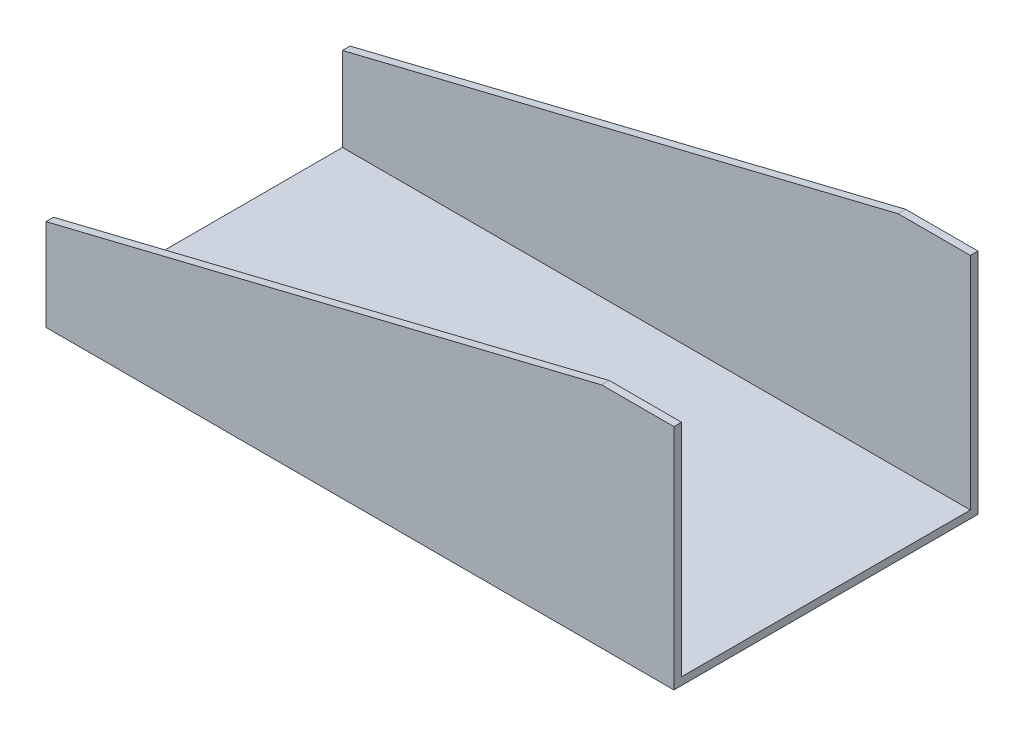
ISO-10303-21;
HEADER;
FILE_DESCRIPTION(('STEP AP214'),'2;1');
FILE_NAME('part.step','',(''),(''),'','','');
FILE_SCHEMA(('AUTOMOTIVE_DESIGN { 1 0 10303 214 1 1 1 1 }'));
ENDSEC;
DATA;
#1=APPLICATION_CONTEXT('core data for automotive mechanical design processes');
#2=APPLICATION_PROTOCOL_DEFINITION('international standard','automotive_design',2000,#1);
#3=PRODUCT_CONTEXT('',#1,'mechanical');
#4=PRODUCT('Part','Part','',(#3));
#5=PRODUCT_RELATED_PRODUCT_CATEGORY('part','',(#4));
#6=PRODUCT_DEFINITION_FORMATION('','',#4);
#7=PRODUCT_DEFINITION_CONTEXT('part definition',#1,'design');
#8=PRODUCT_DEFINITION('design','',#6,#7);
#9=PRODUCT_DEFINITION_SHAPE('','',#8);
#10=(LENGTH_UNIT() NAMED_UNIT(*) SI_UNIT(.MILLI.,.METRE.));
#11=(NAMED_UNIT(*) PLANE_ANGLE_UNIT() SI_UNIT($,.RADIAN.));
#12=(NAMED_UNIT(*) SI_UNIT($,.STERADIAN.) SOLID_ANGLE_UNIT());
#13=UNCERTAINTY_MEASURE_WITH_UNIT(LENGTH_MEASURE(1.E-05),#10,'distance_accuracy_value','');
#14=(GEOMETRIC_REPRESENTATION_CONTEXT(3) GLOBAL_UNCERTAINTY_ASSIGNED_CONTEXT((#13)) GLOBAL_UNIT_ASSIGNED_CONTEXT((#10,
#11,#12)) REPRESENTATION_CONTEXT('',''));
#15=CARTESIAN_POINT('',(0.,0.,0.));
#16=DIRECTION('',(0.,0.,1.));
#17=DIRECTION('',(1.,0.,0.));
#18=AXIS2_PLACEMENT_3D('',#15,#16,#17);
#19=CARTESIAN_POINT('',(-48.5648,1.27,0.));
#20=DIRECTION('',(1.,0.,0.));
#21=DIRECTION('',(0.,0.,-1.));
#22=AXIS2_PLACEMENT_3D('',#19,#20,#21);
#23=PLANE('',#22);
#24=DIRECTION('',(0.,-1.,0.));
#25=VECTOR('',#24,1.);
#26=CARTESIAN_POINT('',(-48.5648,38.1,25.911112371186));
#27=LINE('',#26,#25);
#28=CARTESIAN_POINT('',(-48.5648,15.3072560312873,25.911112371186));
#29=VERTEX_POINT('',#28);
#30=CARTESIAN_POINT('',(-48.5648,0.,25.911112371186));
#31=VERTEX_POINT('',#30);
#32=EDGE_CURVE('E121',#29,#31,#27,.T.);
#33=ORIENTED_EDGE('',*,*,#32,.F.);
#34=DIRECTION('',(0.,0.,1.));
#35=VECTOR('',#34,1.);
#36=CARTESIAN_POINT('',(-48.5648,15.3072560312873,-27.428887628814));
#37=LINE('',#36,#35);
#38=CARTESIAN_POINT('',(-48.5648,15.3072560312873,24.641112371186));
#39=VERTEX_POINT('',#38);
#40=EDGE_CURVE('E108',#39,#29,#37,.T.);
#41=ORIENTED_EDGE('',*,*,#40,.F.);
#42=DIRECTION('',(0.,-1.,0.));
#43=VECTOR('',#42,1.);
#44=CARTESIAN_POINT('',(-48.5648,38.1,24.641112371186));
#45=LINE('',#44,#43);
#46=CARTESIAN_POINT('',(-48.5648,1.27000000000001,24.641112371186));
#47=VERTEX_POINT('',#46);
#48=EDGE_CURVE('E129',#39,#47,#45,.T.);
#49=ORIENTED_EDGE('',*,*,#48,.T.);
#50=DIRECTION('',(0.,0.,1.));
#51=VECTOR('',#50,1.);
#52=CARTESIAN_POINT('',(-48.5648,1.27,0.));
#53=LINE('',#52,#51);
#54=CARTESIAN_POINT('',(-48.5648,1.27,-23.618887628814));
#55=VERTEX_POINT('',#54);
#56=EDGE_CURVE('E142',#55,#47,#53,.T.);
#57=ORIENTED_EDGE('',*,*,#56,.F.);
#58=DIRECTION('',(0.,-1.,0.));
#59=VECTOR('',#58,1.);
#60=CARTESIAN_POINT('',(-48.5648,38.1,-23.618887628814));
#61=LINE('',#60,#59);
#62=CARTESIAN_POINT('',(-48.5648,15.3072560312873,-23.618887628814));
#63=VERTEX_POINT('',#62);
#64=EDGE_CURVE('E165',#63,#55,#61,.T.);
#65=ORIENTED_EDGE('',*,*,#64,.F.);
#66=CARTESIAN_POINT('',(-48.5648,15.3072560312873,-24.888887628814));
#67=VERTEX_POINT('',#66);
#68=EDGE_CURVE('E115',#67,#63,#37,.T.);
#69=ORIENTED_EDGE('',*,*,#68,.F.);
#70=DIRECTION('',(0.,-1.,0.));
#71=VECTOR('',#70,1.);
#72=CARTESIAN_POINT('',(-48.5648,38.1,-24.888887628814));
#73=LINE('',#72,#71);
#74=CARTESIAN_POINT('',(-48.5648,0.,-24.888887628814));
#75=VERTEX_POINT('',#74);
#76=EDGE_CURVE('E177',#67,#75,#73,.T.);
#77=ORIENTED_EDGE('',*,*,#76,.T.);
#78=DIRECTION('',(0.,0.,1.));
#79=VECTOR('',#78,1.);
#80=CARTESIAN_POINT('',(-48.5648,0.,0.));
#81=LINE('',#80,#79);
#82=EDGE_CURVE('E127',#75,#31,#81,.T.);
#83=ORIENTED_EDGE('',*,*,#82,.T.);
#84=EDGE_LOOP('',(#33,#41,#49,#57,#65,#69,#77,#83));
#85=FACE_BOUND('',#84,.T.);
#86=ADVANCED_FACE('F35',(#85),#23,.F.);
#87=CARTESIAN_POINT('',(56.3372,1.27,0.));
#88=DIRECTION('',(1.,0.,0.));
#89=DIRECTION('',(0.,0.,-1.));
#90=AXIS2_PLACEMENT_3D('',#87,#88,#89);
#91=PLANE('',#90);
#92=DIRECTION('',(0.,0.,1.));
#93=VECTOR('',#92,1.);
#94=CARTESIAN_POINT('',(56.3372,0.,0.));
#95=LINE('',#94,#93);
#96=CARTESIAN_POINT('',(56.3372,0.,-24.888887628814));
#97=VERTEX_POINT('',#96);
#98=CARTESIAN_POINT('',(56.3372,0.,25.911112371186));
#99=VERTEX_POINT('',#98);
#100=EDGE_CURVE('E143',#97,#99,#95,.T.);
#101=ORIENTED_EDGE('',*,*,#100,.F.);
#102=DIRECTION('',(0.,-1.,0.));
#103=VECTOR('',#102,1.);
#104=CARTESIAN_POINT('',(56.3372,38.1,-24.888887628814));
#105=LINE('',#104,#103);
#106=CARTESIAN_POINT('',(56.3372,38.1,-24.888887628814));
#107=VERTEX_POINT('',#106);
#108=EDGE_CURVE('E175',#107,#97,#105,.T.);
#109=ORIENTED_EDGE('',*,*,#108,.F.);
#110=DIRECTION('',(0.,0.,1.));
#111=VECTOR('',#110,1.);
#112=CARTESIAN_POINT('',(56.3372,38.1,0.));
#113=LINE('',#112,#111);
#114=CARTESIAN_POINT('',(56.3372,38.1,-23.618887628814));
#115=VERTEX_POINT('',#114);
#116=EDGE_CURVE('E183',#107,#115,#113,.T.);
#117=ORIENTED_EDGE('',*,*,#116,.T.);
#118=DIRECTION('',(0.,-1.,0.));
#119=VECTOR('',#118,1.);
#120=CARTESIAN_POINT('',(56.3372,38.1,-23.618887628814));
#121=LINE('',#120,#119);
#122=CARTESIAN_POINT('',(56.3372,1.27000000000001,-23.618887628814));
#123=VERTEX_POINT('',#122);
#124=EDGE_CURVE('E168',#115,#123,#121,.T.);
#125=ORIENTED_EDGE('',*,*,#124,.T.);
#126=DIRECTION('',(0.,0.,1.));
#127=VECTOR('',#126,1.);
#128=CARTESIAN_POINT('',(56.3372,1.27,0.));
#129=LINE('',#128,#127);
#130=CARTESIAN_POINT('',(56.3372,1.27,24.641112371186));
#131=VERTEX_POINT('',#130);
#132=EDGE_CURVE('E42',#123,#131,#129,.T.);
#133=ORIENTED_EDGE('',*,*,#132,.T.);
#134=DIRECTION('',(0.,-1.,0.));
#135=VECTOR('',#134,1.);
#136=CARTESIAN_POINT('',(56.3372,38.1,24.641112371186));
#137=LINE('',#136,#135);
#138=CARTESIAN_POINT('',(56.3372,38.1,24.641112371186));
#139=VERTEX_POINT('',#138);
#140=EDGE_CURVE('E132',#139,#131,#137,.T.);
#141=ORIENTED_EDGE('',*,*,#140,.F.);
#142=DIRECTION('',(0.,0.,1.));
#143=VECTOR('',#142,1.);
#144=CARTESIAN_POINT('',(56.3372,38.1,0.));
#145=LINE('',#144,#143);
#146=CARTESIAN_POINT('',(56.3372,38.1,25.911112371186));
#147=VERTEX_POINT('',#146);
#148=EDGE_CURVE('E164',#139,#147,#145,.T.);
#149=ORIENTED_EDGE('',*,*,#148,.T.);
#150=DIRECTION('',(0.,-1.,0.));
#151=VECTOR('',#150,1.);
#152=CARTESIAN_POINT('',(56.3372,38.1,25.911112371186));
#153=LINE('',#152,#151);
#154=EDGE_CURVE('E130',#147,#99,#153,.T.);
#155=ORIENTED_EDGE('',*,*,#154,.T.);
#156=EDGE_LOOP('',(#101,#109,#117,#125,#133,#141,#149,#155));
#157=FACE_BOUND('',#156,.T.);
#158=ADVANCED_FACE('F161',(#157),#91,.T.);
#159=CARTESIAN_POINT('',(0.,1.27,0.));
#160=DIRECTION('',(0.,1.,0.));
#161=DIRECTION('',(0.,0.,1.));
#162=AXIS2_PLACEMENT_3D('',#159,#160,#161);
#163=PLANE('',#162);
#164=DIRECTION('',(1.,0.,0.));
#165=VECTOR('',#164,1.);
#166=CARTESIAN_POINT('',(0.,1.27,-23.618887628814));
#167=LINE('',#166,#165);
#168=EDGE_CURVE('E139',#55,#123,#167,.T.);
#169=ORIENTED_EDGE('',*,*,#168,.F.);
#170=ORIENTED_EDGE('',*,*,#56,.T.);
#171=DIRECTION('',(1.,0.,0.));
#172=VECTOR('',#171,1.);
#173=CARTESIAN_POINT('',(0.,1.27,24.641112371186));
#174=LINE('',#173,#172);
#175=EDGE_CURVE('E146',#47,#131,#174,.T.);
#176=ORIENTED_EDGE('',*,*,#175,.T.);
#177=ORIENTED_EDGE('',*,*,#132,.F.);
#178=EDGE_LOOP('',(#169,#170,#176,#177));
#179=FACE_BOUND('',#178,.T.);
#180=ADVANCED_FACE('F207',(#179),#163,.T.);
#181=CARTESIAN_POINT('',(0.,0.,0.));
#182=DIRECTION('',(0.,1.,0.));
#183=DIRECTION('',(0.,0.,1.));
#184=AXIS2_PLACEMENT_3D('',#181,#182,#183);
#185=PLANE('',#184);
#186=ORIENTED_EDGE('',*,*,#82,.F.);
#187=DIRECTION('',(1.,0.,0.));
#188=VECTOR('',#187,1.);
#189=CARTESIAN_POINT('',(0.,0.,-24.888887628814));
#190=LINE('',#189,#188);
#191=EDGE_CURVE('E156',#75,#97,#190,.T.);
#192=ORIENTED_EDGE('',*,*,#191,.T.);
#193=ORIENTED_EDGE('',*,*,#100,.T.);
#194=DIRECTION('',(1.,0.,0.));
#195=VECTOR('',#194,1.);
#196=CARTESIAN_POINT('',(0.,0.,25.911112371186));
#197=LINE('',#196,#195);
#198=EDGE_CURVE('E154',#31,#99,#197,.T.);
#199=ORIENTED_EDGE('',*,*,#198,.F.);
#200=EDGE_LOOP('',(#186,#192,#193,#199));
#201=FACE_BOUND('',#200,.T.);
#202=ADVANCED_FACE('F153',(#201),#185,.F.);
#203=CARTESIAN_POINT('',(0.,38.1,24.641112371186));
#204=DIRECTION('',(0.,0.,-1.));
#205=DIRECTION('',(-1.,0.,0.));
#206=AXIS2_PLACEMENT_3D('',#203,#204,#205);
#207=PLANE('',#206);
#208=DIRECTION('',(-0.971153228482447,-0.238456299577343,0.));
#209=VECTOR('',#208,1.);
#210=CARTESIAN_POINT('',(2.5168262145489,27.8498035987276,24.641112371186));
#211=LINE('',#210,#209);
#212=CARTESIAN_POINT('',(44.2624682685394,38.1,24.641112371186));
#213=VERTEX_POINT('',#212);
#214=EDGE_CURVE('E111',#213,#39,#211,.T.);
#215=ORIENTED_EDGE('',*,*,#214,.F.);
#216=DIRECTION('',(1.,0.,0.));
#217=VECTOR('',#216,1.);
#218=CARTESIAN_POINT('',(0.,38.1,24.641112371186));
#219=LINE('',#218,#217);
#220=EDGE_CURVE('E166',#213,#139,#219,.T.);
#221=ORIENTED_EDGE('',*,*,#220,.T.);
#222=ORIENTED_EDGE('',*,*,#140,.T.);
#223=ORIENTED_EDGE('',*,*,#175,.F.);
#224=ORIENTED_EDGE('',*,*,#48,.F.);
#225=EDGE_LOOP('',(#215,#221,#222,#223,#224));
#226=FACE_BOUND('',#225,.T.);
#227=ADVANCED_FACE('F233',(#226),#207,.T.);
#228=CARTESIAN_POINT('',(0.,38.1,25.911112371186));
#229=DIRECTION('',(0.,0.,-1.));
#230=DIRECTION('',(-1.,0.,0.));
#231=AXIS2_PLACEMENT_3D('',#228,#229,#230);
#232=PLANE('',#231);
#233=DIRECTION('',(1.,0.,0.));
#234=VECTOR('',#233,1.);
#235=CARTESIAN_POINT('',(0.,38.1,25.911112371186));
#236=LINE('',#235,#234);
#237=CARTESIAN_POINT('',(44.2624682685394,38.1,25.911112371186));
#238=VERTEX_POINT('',#237);
#239=EDGE_CURVE('E124',#238,#147,#236,.T.);
#240=ORIENTED_EDGE('',*,*,#239,.F.);
#241=DIRECTION('',(0.971153228482447,0.238456299577343,0.));
#242=VECTOR('',#241,1.);
#243=CARTESIAN_POINT('',(-48.5648,15.3072560312873,25.911112371186));
#244=LINE('',#243,#242);
#245=EDGE_CURVE('E49',#29,#238,#244,.T.);
#246=ORIENTED_EDGE('',*,*,#245,.F.);
#247=ORIENTED_EDGE('',*,*,#32,.T.);
#248=ORIENTED_EDGE('',*,*,#198,.T.);
#249=ORIENTED_EDGE('',*,*,#154,.F.);
#250=EDGE_LOOP('',(#240,#246,#247,#248,#249));
#251=FACE_BOUND('',#250,.T.);
#252=ADVANCED_FACE('F119',(#251),#232,.F.);
#253=CARTESIAN_POINT('',(0.,38.1,0.));
#254=DIRECTION('',(0.,1.,0.));
#255=DIRECTION('',(0.,0.,1.));
#256=AXIS2_PLACEMENT_3D('',#253,#254,#255);
#257=PLANE('',#256);
#258=DIRECTION('',(0.,0.,1.));
#259=VECTOR('',#258,1.);
#260=CARTESIAN_POINT('',(44.2624682685394,38.1,-27.428887628814));
#261=LINE('',#260,#259);
#262=EDGE_CURVE('E190',#213,#238,#261,.T.);
#263=ORIENTED_EDGE('',*,*,#262,.T.);
#264=ORIENTED_EDGE('',*,*,#239,.T.);
#265=ORIENTED_EDGE('',*,*,#148,.F.);
#266=ORIENTED_EDGE('',*,*,#220,.F.);
#267=EDGE_LOOP('',(#263,#264,#265,#266));
#268=FACE_BOUND('',#267,.T.);
#269=ADVANCED_FACE('F221',(#268),#257,.T.);
#270=CARTESIAN_POINT('',(0.,38.1,-23.618887628814));
#271=DIRECTION('',(0.,0.,-1.));
#272=DIRECTION('',(-1.,0.,0.));
#273=AXIS2_PLACEMENT_3D('',#270,#271,#272);
#274=PLANE('',#273);
#275=DIRECTION('',(1.,0.,0.));
#276=VECTOR('',#275,1.);
#277=CARTESIAN_POINT('',(0.,38.1,-23.618887628814));
#278=LINE('',#277,#276);
#279=CARTESIAN_POINT('',(44.2624682685394,38.1,-23.618887628814));
#280=VERTEX_POINT('',#279);
#281=EDGE_CURVE('E181',#280,#115,#278,.T.);
#282=ORIENTED_EDGE('',*,*,#281,.F.);
#283=DIRECTION('',(-0.971153228482447,-0.238456299577343,0.));
#284=VECTOR('',#283,1.);
#285=CARTESIAN_POINT('',(2.5168262145489,27.8498035987276,-23.618887628814));
#286=LINE('',#285,#284);
#287=EDGE_CURVE('E56',#280,#63,#286,.T.);
#288=ORIENTED_EDGE('',*,*,#287,.T.);
#289=ORIENTED_EDGE('',*,*,#64,.T.);
#290=ORIENTED_EDGE('',*,*,#168,.T.);
#291=ORIENTED_EDGE('',*,*,#124,.F.);
#292=EDGE_LOOP('',(#282,#288,#289,#290,#291));
#293=FACE_BOUND('',#292,.T.);
#294=ADVANCED_FACE('F201',(#293),#274,.F.);
#295=CARTESIAN_POINT('',(0.,38.1,-24.888887628814));
#296=DIRECTION('',(0.,0.,-1.));
#297=DIRECTION('',(-1.,0.,0.));
#298=AXIS2_PLACEMENT_3D('',#295,#296,#297);
#299=PLANE('',#298);
#300=DIRECTION('',(-0.971153228482447,-0.238456299577343,0.));
#301=VECTOR('',#300,1.);
#302=CARTESIAN_POINT('',(2.5168262145489,27.8498035987276,-24.888887628814));
#303=LINE('',#302,#301);
#304=CARTESIAN_POINT('',(44.2624682685394,38.1,-24.888887628814));
#305=VERTEX_POINT('',#304);
#306=EDGE_CURVE('E189',#305,#67,#303,.T.);
#307=ORIENTED_EDGE('',*,*,#306,.F.);
#308=DIRECTION('',(1.,0.,0.));
#309=VECTOR('',#308,1.);
#310=CARTESIAN_POINT('',(0.,38.1,-24.888887628814));
#311=LINE('',#310,#309);
#312=EDGE_CURVE('E179',#305,#107,#311,.T.);
#313=ORIENTED_EDGE('',*,*,#312,.T.);
#314=ORIENTED_EDGE('',*,*,#108,.T.);
#315=ORIENTED_EDGE('',*,*,#191,.F.);
#316=ORIENTED_EDGE('',*,*,#76,.F.);
#317=EDGE_LOOP('',(#307,#313,#314,#315,#316));
#318=FACE_BOUND('',#317,.T.);
#319=ADVANCED_FACE('F213',(#318),#299,.T.);
#320=CARTESIAN_POINT('',(0.,38.1,0.));
#321=DIRECTION('',(0.,1.,0.));
#322=DIRECTION('',(0.,0.,1.));
#323=AXIS2_PLACEMENT_3D('',#320,#321,#322);
#324=PLANE('',#323);
#325=DIRECTION('',(0.,0.,-1.));
#326=VECTOR('',#325,1.);
#327=CARTESIAN_POINT('',(44.2624682685394,38.1,0.));
#328=LINE('',#327,#326);
#329=EDGE_CURVE('E11',#280,#305,#328,.T.);
#330=ORIENTED_EDGE('',*,*,#329,.F.);
#331=ORIENTED_EDGE('',*,*,#281,.T.);
#332=ORIENTED_EDGE('',*,*,#116,.F.);
#333=ORIENTED_EDGE('',*,*,#312,.F.);
#334=EDGE_LOOP('',(#330,#331,#332,#333));
#335=FACE_BOUND('',#334,.T.);
#336=ADVANCED_FACE('F211',(#335),#324,.T.);
#337=CARTESIAN_POINT('',(-48.5648,15.3072560312873,-27.428887628814));
#338=DIRECTION('',(0.238456299577343,-0.971153228482447,0.));
#339=DIRECTION('',(0.971153228482447,0.238456299577343,0.));
#340=AXIS2_PLACEMENT_3D('',#337,#338,#339);
#341=PLANE('',#340);
#342=ORIENTED_EDGE('',*,*,#329,.T.);
#343=ORIENTED_EDGE('',*,*,#306,.T.);
#344=ORIENTED_EDGE('',*,*,#68,.T.);
#345=ORIENTED_EDGE('',*,*,#287,.F.);
#346=EDGE_LOOP('',(#342,#343,#344,#345));
#347=FACE_BOUND('',#346,.T.);
#348=ADVANCED_FACE('F195',(#347),#341,.F.);
#349=ORIENTED_EDGE('',*,*,#214,.T.);
#350=ORIENTED_EDGE('',*,*,#40,.T.);
#351=ORIENTED_EDGE('',*,*,#245,.T.);
#352=ORIENTED_EDGE('',*,*,#262,.F.);
#353=EDGE_LOOP('',(#349,#350,#351,#352));
#354=FACE_BOUND('',#353,.T.);
#355=ADVANCED_FACE('F109',(#354),#341,.F.);
#356=CLOSED_SHELL('',(#86,#158,#180,#202,#227,#252,#269,#294,#319,#336,#348,#355));
#357=MANIFOLD_SOLID_BREP('B2',#356);
#358=ADVANCED_BREP_SHAPE_REPRESENTATION('',(#18,#357),#14);
#359=SHAPE_DEFINITION_REPRESENTATION(#9,#358);
ENDSEC;
END-ISO-10303-21;
